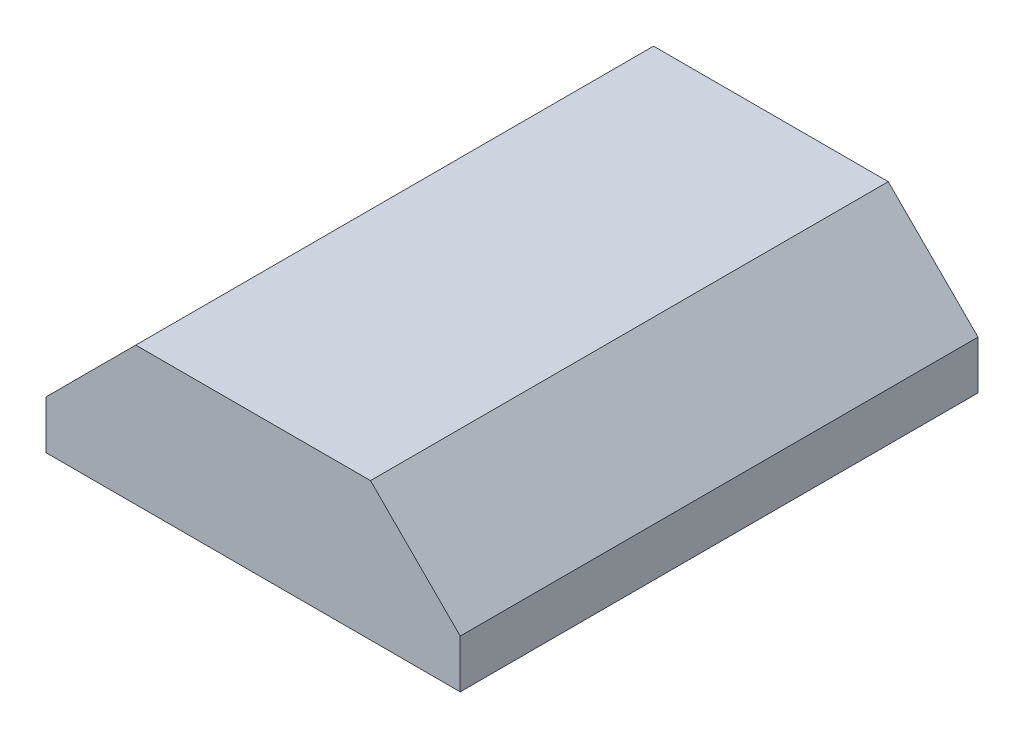
ISO-10303-21;
HEADER;
FILE_DESCRIPTION(('STEP AP214'),'2;1');
FILE_NAME('part.step','',(''),(''),'','','');
FILE_SCHEMA(('AUTOMOTIVE_DESIGN { 1 0 10303 214 1 1 1 1 }'));
ENDSEC;
DATA;
#1=APPLICATION_CONTEXT('core data for automotive mechanical design processes');
#2=APPLICATION_PROTOCOL_DEFINITION('international standard','automotive_design',2000,#1);
#3=PRODUCT_CONTEXT('',#1,'mechanical');
#4=PRODUCT('Part','Part','',(#3));
#5=PRODUCT_RELATED_PRODUCT_CATEGORY('part','',(#4));
#6=PRODUCT_DEFINITION_FORMATION('','',#4);
#7=PRODUCT_DEFINITION_CONTEXT('part definition',#1,'design');
#8=PRODUCT_DEFINITION('design','',#6,#7);
#9=PRODUCT_DEFINITION_SHAPE('','',#8);
#10=(LENGTH_UNIT() NAMED_UNIT(*) SI_UNIT(.MILLI.,.METRE.));
#11=(NAMED_UNIT(*) PLANE_ANGLE_UNIT() SI_UNIT($,.RADIAN.));
#12=(NAMED_UNIT(*) SI_UNIT($,.STERADIAN.) SOLID_ANGLE_UNIT());
#13=UNCERTAINTY_MEASURE_WITH_UNIT(LENGTH_MEASURE(1.E-05),#10,'distance_accuracy_value','');
#14=(GEOMETRIC_REPRESENTATION_CONTEXT(3) GLOBAL_UNCERTAINTY_ASSIGNED_CONTEXT((#13)) GLOBAL_UNIT_ASSIGNED_CONTEXT((#10,
#11,#12)) REPRESENTATION_CONTEXT('',''));
#15=CARTESIAN_POINT('',(0.,0.,0.));
#16=DIRECTION('',(0.,0.,1.));
#17=DIRECTION('',(1.,0.,0.));
#18=AXIS2_PLACEMENT_3D('',#15,#16,#17);
#19=CARTESIAN_POINT('',(3.4,1.80885878693797,15.));
#20=DIRECTION('',(0.707106781186549,0.707106781186546,0.));
#21=DIRECTION('',(-0.707106781186546,0.707106781186549,0.));
#22=AXIS2_PLACEMENT_3D('',#19,#20,#21);
#23=PLANE('',#22);
#24=DIRECTION('',(0.707106781186546,-0.707106781186549,0.));
#25=VECTOR('',#24,1.);
#26=CARTESIAN_POINT('',(3.4,1.80885878693797,0.));
#27=LINE('',#26,#25);
#28=CARTESIAN_POINT('',(3.4,1.80885878693797,0.));
#29=VERTEX_POINT('',#28);
#30=CARTESIAN_POINT('',(6.,-0.791141213062042,0.));
#31=VERTEX_POINT('',#30);
#32=EDGE_CURVE('E127',#29,#31,#27,.T.);
#33=ORIENTED_EDGE('',*,*,#32,.F.);
#34=DIRECTION('',(0.,0.,-1.));
#35=VECTOR('',#34,1.);
#36=CARTESIAN_POINT('',(3.4,1.80885878693797,15.));
#37=LINE('',#36,#35);
#38=CARTESIAN_POINT('',(3.4,1.80885878693797,15.));
#39=VERTEX_POINT('',#38);
#40=EDGE_CURVE('E11',#39,#29,#37,.T.);
#41=ORIENTED_EDGE('',*,*,#40,.F.);
#42=DIRECTION('',(0.707106781186546,-0.707106781186549,0.));
#43=VECTOR('',#42,1.);
#44=CARTESIAN_POINT('',(3.4,1.80885878693797,15.));
#45=LINE('',#44,#43);
#46=CARTESIAN_POINT('',(6.,-0.791141213062042,15.));
#47=VERTEX_POINT('',#46);
#48=EDGE_CURVE('E139',#39,#47,#45,.T.);
#49=ORIENTED_EDGE('',*,*,#48,.T.);
#50=DIRECTION('',(0.,0.,-1.));
#51=VECTOR('',#50,1.);
#52=CARTESIAN_POINT('',(6.,-0.791141213062042,15.));
#53=LINE('',#52,#51);
#54=EDGE_CURVE('E44',#47,#31,#53,.T.);
#55=ORIENTED_EDGE('',*,*,#54,.T.);
#56=EDGE_LOOP('',(#33,#41,#49,#55));
#57=FACE_BOUND('',#56,.T.);
#58=ADVANCED_FACE('F41',(#57),#23,.T.);
#59=CARTESIAN_POINT('',(3.4,1.80885878693797,15.));
#60=DIRECTION('',(0.,-1.,0.));
#61=DIRECTION('',(0.,0.,-1.));
#62=AXIS2_PLACEMENT_3D('',#59,#60,#61);
#63=PLANE('',#62);
#64=DIRECTION('',(-1.,0.,0.));
#65=VECTOR('',#64,1.);
#66=CARTESIAN_POINT('',(3.4,1.80885878693797,0.));
#67=LINE('',#66,#65);
#68=CARTESIAN_POINT('',(-3.4,1.80885878693797,0.));
#69=VERTEX_POINT('',#68);
#70=EDGE_CURVE('E80',#29,#69,#67,.T.);
#71=ORIENTED_EDGE('',*,*,#70,.T.);
#72=DIRECTION('',(0.,0.,-1.));
#73=VECTOR('',#72,1.);
#74=CARTESIAN_POINT('',(-3.4,1.80885878693797,15.));
#75=LINE('',#74,#73);
#76=CARTESIAN_POINT('',(-3.4,1.80885878693797,15.));
#77=VERTEX_POINT('',#76);
#78=EDGE_CURVE('E50',#77,#69,#75,.T.);
#79=ORIENTED_EDGE('',*,*,#78,.F.);
#80=DIRECTION('',(-1.,0.,0.));
#81=VECTOR('',#80,1.);
#82=CARTESIAN_POINT('',(3.4,1.80885878693797,15.));
#83=LINE('',#82,#81);
#84=EDGE_CURVE('E105',#39,#77,#83,.T.);
#85=ORIENTED_EDGE('',*,*,#84,.F.);
#86=ORIENTED_EDGE('',*,*,#40,.T.);
#87=EDGE_LOOP('',(#71,#79,#85,#86));
#88=FACE_BOUND('',#87,.T.);
#89=ADVANCED_FACE('F159',(#88),#63,.F.);
#90=CARTESIAN_POINT('',(-3.4,1.80885878693797,15.));
#91=DIRECTION('',(0.707106781186549,-0.707106781186546,0.));
#92=DIRECTION('',(0.707106781186546,0.707106781186549,0.));
#93=AXIS2_PLACEMENT_3D('',#90,#91,#92);
#94=PLANE('',#93);
#95=DIRECTION('',(-0.707106781186546,-0.707106781186549,0.));
#96=VECTOR('',#95,1.);
#97=CARTESIAN_POINT('',(-3.4,1.80885878693797,0.));
#98=LINE('',#97,#96);
#99=CARTESIAN_POINT('',(-6.,-0.791141213062042,0.));
#100=VERTEX_POINT('',#99);
#101=EDGE_CURVE('E112',#69,#100,#98,.T.);
#102=ORIENTED_EDGE('',*,*,#101,.T.);
#103=DIRECTION('',(0.,0.,-1.));
#104=VECTOR('',#103,1.);
#105=CARTESIAN_POINT('',(-6.,-0.791141213062042,15.));
#106=LINE('',#105,#104);
#107=CARTESIAN_POINT('',(-6.,-0.791141213062042,15.));
#108=VERTEX_POINT('',#107);
#109=EDGE_CURVE('E109',#108,#100,#106,.T.);
#110=ORIENTED_EDGE('',*,*,#109,.F.);
#111=DIRECTION('',(-0.707106781186546,-0.707106781186549,0.));
#112=VECTOR('',#111,1.);
#113=CARTESIAN_POINT('',(-3.4,1.80885878693797,15.));
#114=LINE('',#113,#112);
#115=EDGE_CURVE('E98',#77,#108,#114,.T.);
#116=ORIENTED_EDGE('',*,*,#115,.F.);
#117=ORIENTED_EDGE('',*,*,#78,.T.);
#118=EDGE_LOOP('',(#102,#110,#116,#117));
#119=FACE_BOUND('',#118,.T.);
#120=ADVANCED_FACE('F110',(#119),#94,.F.);
#121=CARTESIAN_POINT('',(-6.,-0.791141213062042,15.));
#122=DIRECTION('',(1.,0.,0.));
#123=DIRECTION('',(0.,0.,-1.));
#124=AXIS2_PLACEMENT_3D('',#121,#122,#123);
#125=PLANE('',#124);
#126=DIRECTION('',(0.,-1.,0.));
#127=VECTOR('',#126,1.);
#128=CARTESIAN_POINT('',(-6.,-0.791141213062042,0.));
#129=LINE('',#128,#127);
#130=CARTESIAN_POINT('',(-6.,-2.19114121306203,0.));
#131=VERTEX_POINT('',#130);
#132=EDGE_CURVE('E136',#100,#131,#129,.T.);
#133=ORIENTED_EDGE('',*,*,#132,.T.);
#134=DIRECTION('',(0.,0.,-1.));
#135=VECTOR('',#134,1.);
#136=CARTESIAN_POINT('',(-6.,-2.19114121306203,15.));
#137=LINE('',#136,#135);
#138=CARTESIAN_POINT('',(-6.,-2.19114121306203,15.));
#139=VERTEX_POINT('',#138);
#140=EDGE_CURVE('E115',#139,#131,#137,.T.);
#141=ORIENTED_EDGE('',*,*,#140,.F.);
#142=DIRECTION('',(0.,-1.,0.));
#143=VECTOR('',#142,1.);
#144=CARTESIAN_POINT('',(-6.,-0.791141213062042,15.));
#145=LINE('',#144,#143);
#146=EDGE_CURVE('E103',#108,#139,#145,.T.);
#147=ORIENTED_EDGE('',*,*,#146,.F.);
#148=ORIENTED_EDGE('',*,*,#109,.T.);
#149=EDGE_LOOP('',(#133,#141,#147,#148));
#150=FACE_BOUND('',#149,.T.);
#151=ADVANCED_FACE('F117',(#150),#125,.F.);
#152=CARTESIAN_POINT('',(-6.,-2.19114121306203,15.));
#153=DIRECTION('',(0.,1.,0.));
#154=DIRECTION('',(0.,0.,1.));
#155=AXIS2_PLACEMENT_3D('',#152,#153,#154);
#156=PLANE('',#155);
#157=DIRECTION('',(1.,0.,0.));
#158=VECTOR('',#157,1.);
#159=CARTESIAN_POINT('',(-6.,-2.19114121306203,0.));
#160=LINE('',#159,#158);
#161=CARTESIAN_POINT('',(6.,-2.19114121306203,0.));
#162=VERTEX_POINT('',#161);
#163=EDGE_CURVE('E133',#131,#162,#160,.T.);
#164=ORIENTED_EDGE('',*,*,#163,.T.);
#165=DIRECTION('',(0.,0.,-1.));
#166=VECTOR('',#165,1.);
#167=CARTESIAN_POINT('',(6.,-2.19114121306203,15.));
#168=LINE('',#167,#166);
#169=CARTESIAN_POINT('',(6.,-2.19114121306203,15.));
#170=VERTEX_POINT('',#169);
#171=EDGE_CURVE('E142',#170,#162,#168,.T.);
#172=ORIENTED_EDGE('',*,*,#171,.F.);
#173=DIRECTION('',(1.,0.,0.));
#174=VECTOR('',#173,1.);
#175=CARTESIAN_POINT('',(-6.,-2.19114121306203,15.));
#176=LINE('',#175,#174);
#177=EDGE_CURVE('E120',#139,#170,#176,.T.);
#178=ORIENTED_EDGE('',*,*,#177,.F.);
#179=ORIENTED_EDGE('',*,*,#140,.T.);
#180=EDGE_LOOP('',(#164,#172,#178,#179));
#181=FACE_BOUND('',#180,.T.);
#182=ADVANCED_FACE('F149',(#181),#156,.F.);
#183=CARTESIAN_POINT('',(6.,-0.791141213062042,15.));
#184=DIRECTION('',(1.,0.,0.));
#185=DIRECTION('',(0.,0.,-1.));
#186=AXIS2_PLACEMENT_3D('',#183,#184,#185);
#187=PLANE('',#186);
#188=DIRECTION('',(0.,-1.,0.));
#189=VECTOR('',#188,1.);
#190=CARTESIAN_POINT('',(6.,-0.791141213062042,0.));
#191=LINE('',#190,#189);
#192=EDGE_CURVE('E130',#31,#162,#191,.T.);
#193=ORIENTED_EDGE('',*,*,#192,.F.);
#194=ORIENTED_EDGE('',*,*,#54,.F.);
#195=DIRECTION('',(0.,-1.,0.));
#196=VECTOR('',#195,1.);
#197=CARTESIAN_POINT('',(6.,-0.791141213062042,15.));
#198=LINE('',#197,#196);
#199=EDGE_CURVE('E122',#47,#170,#198,.T.);
#200=ORIENTED_EDGE('',*,*,#199,.T.);
#201=ORIENTED_EDGE('',*,*,#171,.T.);
#202=EDGE_LOOP('',(#193,#194,#200,#201));
#203=FACE_BOUND('',#202,.T.);
#204=ADVANCED_FACE('F144',(#203),#187,.T.);
#205=CARTESIAN_POINT('',(0.,0.,15.));
#206=DIRECTION('',(0.,0.,-1.));
#207=DIRECTION('',(-1.,0.,0.));
#208=AXIS2_PLACEMENT_3D('',#205,#206,#207);
#209=PLANE('',#208);
#210=ORIENTED_EDGE('',*,*,#48,.F.);
#211=ORIENTED_EDGE('',*,*,#84,.T.);
#212=ORIENTED_EDGE('',*,*,#115,.T.);
#213=ORIENTED_EDGE('',*,*,#146,.T.);
#214=ORIENTED_EDGE('',*,*,#177,.T.);
#215=ORIENTED_EDGE('',*,*,#199,.F.);
#216=EDGE_LOOP('',(#210,#211,#212,#213,#214,#215));
#217=FACE_BOUND('',#216,.T.);
#218=ADVANCED_FACE('F101',(#217),#209,.F.);
#219=CARTESIAN_POINT('',(0.,0.,0.));
#220=DIRECTION('',(0.,0.,-1.));
#221=DIRECTION('',(-1.,0.,0.));
#222=AXIS2_PLACEMENT_3D('',#219,#220,#221);
#223=PLANE('',#222);
#224=ORIENTED_EDGE('',*,*,#32,.T.);
#225=ORIENTED_EDGE('',*,*,#192,.T.);
#226=ORIENTED_EDGE('',*,*,#163,.F.);
#227=ORIENTED_EDGE('',*,*,#132,.F.);
#228=ORIENTED_EDGE('',*,*,#101,.F.);
#229=ORIENTED_EDGE('',*,*,#70,.F.);
#230=EDGE_LOOP('',(#224,#225,#226,#227,#228,#229));
#231=FACE_BOUND('',#230,.T.);
#232=ADVANCED_FACE('F147',(#231),#223,.T.);
#233=CLOSED_SHELL('',(#58,#89,#120,#151,#182,#204,#218,#232));
#234=MANIFOLD_SOLID_BREP('B2',#233);
#235=ADVANCED_BREP_SHAPE_REPRESENTATION('',(#18,#234),#14);
#236=SHAPE_DEFINITION_REPRESENTATION(#9,#235);
ENDSEC;
END-ISO-10303-21;
